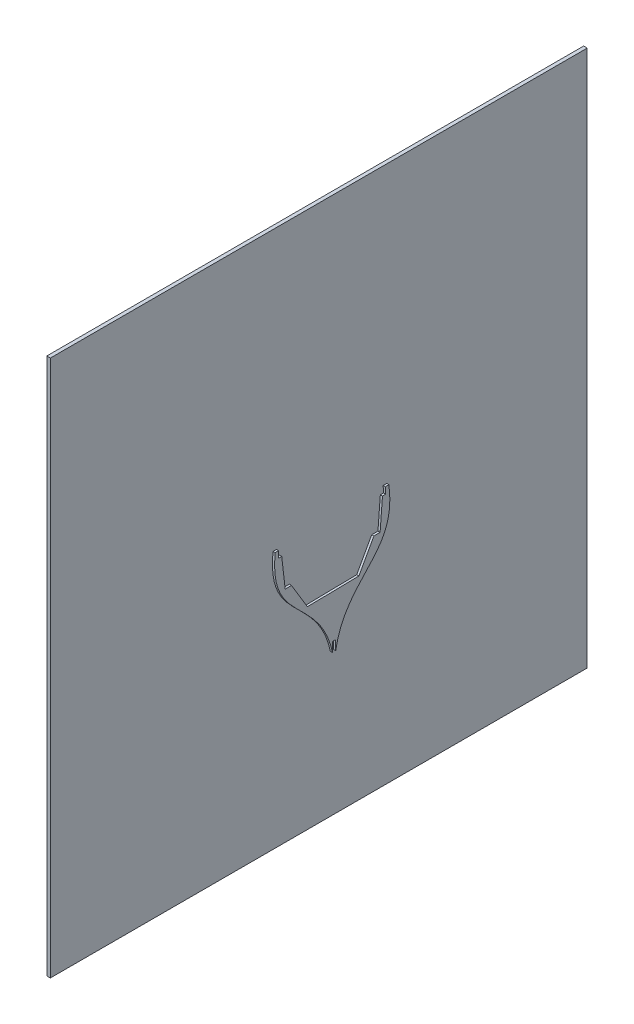
ISO-10303-21;
HEADER;
FILE_DESCRIPTION(('STEP AP214'),'2;1');
FILE_NAME('part.step','',(''),(''),'','','');
FILE_SCHEMA(('AUTOMOTIVE_DESIGN { 1 0 10303 214 1 1 1 1 }'));
ENDSEC;
DATA;
#1=APPLICATION_CONTEXT('core data for automotive mechanical design processes');
#2=APPLICATION_PROTOCOL_DEFINITION('international standard','automotive_design',2000,#1);
#3=PRODUCT_CONTEXT('',#1,'mechanical');
#4=PRODUCT('Part','Part','',(#3));
#5=PRODUCT_RELATED_PRODUCT_CATEGORY('part','',(#4));
#6=PRODUCT_DEFINITION_FORMATION('','',#4);
#7=PRODUCT_DEFINITION_CONTEXT('part definition',#1,'design');
#8=PRODUCT_DEFINITION('design','',#6,#7);
#9=PRODUCT_DEFINITION_SHAPE('','',#8);
#10=(LENGTH_UNIT() NAMED_UNIT(*) SI_UNIT(.MILLI.,.METRE.));
#11=(NAMED_UNIT(*) PLANE_ANGLE_UNIT() SI_UNIT($,.RADIAN.));
#12=(NAMED_UNIT(*) SI_UNIT($,.STERADIAN.) SOLID_ANGLE_UNIT());
#13=UNCERTAINTY_MEASURE_WITH_UNIT(LENGTH_MEASURE(1.E-05),#10,'distance_accuracy_value','');
#14=(GEOMETRIC_REPRESENTATION_CONTEXT(3) GLOBAL_UNCERTAINTY_ASSIGNED_CONTEXT((#13)) GLOBAL_UNIT_ASSIGNED_CONTEXT((#10,
#11,#12)) REPRESENTATION_CONTEXT('',''));
#15=CARTESIAN_POINT('',(0.,0.,0.));
#16=DIRECTION('',(0.,0.,1.));
#17=DIRECTION('',(1.,0.,0.));
#18=AXIS2_PLACEMENT_3D('',#15,#16,#17);
#19=CARTESIAN_POINT('',(6.,352.290806153637,165.357562292261));
#20=CARTESIAN_POINT('',(6.,144.442522752796,186.058304210706));
#21=CARTESIAN_POINT('',(6.,210.423165767166,8.75529863276436));
#22=CARTESIAN_POINT('',(6.,18.0649619587303,4.61229483232223));
#23=CARTESIAN_POINT('',(6.,0.,0.));
#24=B_SPLINE_CURVE_WITH_KNOTS('',4,(#19,#20,#21,#22,#23),.UNSPECIFIED.,.F.,.F.,(5,5),(0.,1.),.UNSPECIFIED.);
#25=DIRECTION('',(-1.,0.,0.));
#26=VECTOR('',#25,1.);
#27=SURFACE_OF_LINEAR_EXTRUSION('',#24,#26);
#28=CARTESIAN_POINT('',(0.,352.290806153637,165.357562292261));
#29=CARTESIAN_POINT('',(0.,144.442522752796,186.058304210706));
#30=CARTESIAN_POINT('',(0.,210.423165767166,8.75529863276436));
#31=CARTESIAN_POINT('',(0.,18.0649619587303,4.61229483232223));
#32=CARTESIAN_POINT('',(0.,0.,0.));
#33=B_SPLINE_CURVE_WITH_KNOTS('',4,(#28,#29,#30,#31,#32),.UNSPECIFIED.,.F.,.F.,(5,5),(0.,1.),.UNSPECIFIED.);
#34=CARTESIAN_POINT('',(0.,352.290806153637,165.357562292261));
#35=VERTEX_POINT('',#34);
#36=CARTESIAN_POINT('',(0.,30.3795413183631,5.05181360286008));
#37=VERTEX_POINT('',#36);
#38=EDGE_CURVE('E192',#35,#37,#33,.T.);
#39=ORIENTED_EDGE('',*,*,#38,.T.);
#40=DIRECTION('',(1.,0.,0.));
#41=VECTOR('',#40,1.);
#42=CARTESIAN_POINT('',(0.,30.3795413183631,5.05181360286008));
#43=LINE('',#42,#41);
#44=CARTESIAN_POINT('',(6.,30.3795413183631,5.05181360286008));
#45=VERTEX_POINT('',#44);
#46=EDGE_CURVE('E198',#37,#45,#43,.T.);
#47=ORIENTED_EDGE('',*,*,#46,.T.);
#48=CARTESIAN_POINT('',(6.,352.290806153637,165.357562292261));
#49=VERTEX_POINT('',#48);
#50=EDGE_CURVE('E232',#49,#45,#24,.T.);
#51=ORIENTED_EDGE('',*,*,#50,.F.);
#52=DIRECTION('',(-1.,0.,0.));
#53=VECTOR('',#52,1.);
#54=CARTESIAN_POINT('',(6.,352.290806153637,165.357562292261));
#55=LINE('',#54,#53);
#56=EDGE_CURVE('E188',#49,#35,#55,.T.);
#57=ORIENTED_EDGE('',*,*,#56,.T.);
#58=EDGE_LOOP('',(#39,#47,#51,#57));
#59=FACE_BOUND('',#58,.T.);
#60=ADVANCED_FACE('F45',(#59),#27,.F.);
#61=CARTESIAN_POINT('',(6.,0.,0.));
#62=CARTESIAN_POINT('',(6.,18.2201613043675,-3.95497613563854));
#63=CARTESIAN_POINT('',(6.,210.602210253033,-1.12826511189856));
#64=CARTESIAN_POINT('',(6.,151.086572632435,-180.704683157741));
#65=CARTESIAN_POINT('',(6.,358.048725482523,-152.489493696973));
#66=B_SPLINE_CURVE_WITH_KNOTS('',4,(#61,#62,#63,#64,#65),.UNSPECIFIED.,.F.,.F.,(5,5),(0.,1.),.UNSPECIFIED.);
#67=DIRECTION('',(-1.,0.,0.));
#68=VECTOR('',#67,1.);
#69=SURFACE_OF_LINEAR_EXTRUSION('',#66,#68);
#70=CARTESIAN_POINT('',(6.,30.5425797136652,-3.94818639713992));
#71=VERTEX_POINT('',#70);
#72=CARTESIAN_POINT('',(6.,358.048725482523,-152.489493696973));
#73=VERTEX_POINT('',#72);
#74=EDGE_CURVE('E128',#71,#73,#66,.T.);
#75=ORIENTED_EDGE('',*,*,#74,.F.);
#76=DIRECTION('',(1.,0.,0.));
#77=VECTOR('',#76,1.);
#78=CARTESIAN_POINT('',(0.,30.5425797136652,-3.94818639713992));
#79=LINE('',#78,#77);
#80=CARTESIAN_POINT('',(0.,30.5425797136652,-3.94818639713992));
#81=VERTEX_POINT('',#80);
#82=EDGE_CURVE('E322',#81,#71,#79,.T.);
#83=ORIENTED_EDGE('',*,*,#82,.F.);
#84=CARTESIAN_POINT('',(0.,0.,0.));
#85=CARTESIAN_POINT('',(0.,18.2201613043675,-3.95497613563854));
#86=CARTESIAN_POINT('',(0.,210.602210253033,-1.12826511189856));
#87=CARTESIAN_POINT('',(0.,151.086572632435,-180.704683157741));
#88=CARTESIAN_POINT('',(0.,358.048725482523,-152.489493696973));
#89=B_SPLINE_CURVE_WITH_KNOTS('',4,(#84,#85,#86,#87,#88),.UNSPECIFIED.,.F.,.F.,(5,5),(0.,1.),.UNSPECIFIED.);
#90=CARTESIAN_POINT('',(0.,358.048725482523,-152.489493696973));
#91=VERTEX_POINT('',#90);
#92=EDGE_CURVE('E197',#81,#91,#89,.T.);
#93=ORIENTED_EDGE('',*,*,#92,.T.);
#94=DIRECTION('',(-1.,0.,0.));
#95=VECTOR('',#94,1.);
#96=CARTESIAN_POINT('',(6.,358.048725482523,-152.489493696973));
#97=LINE('',#96,#95);
#98=EDGE_CURVE('E13',#73,#91,#97,.T.);
#99=ORIENTED_EDGE('',*,*,#98,.F.);
#100=EDGE_LOOP('',(#75,#83,#93,#99));
#101=FACE_BOUND('',#100,.T.);
#102=ADVANCED_FACE('F334',(#101),#69,.F.);
#103=CARTESIAN_POINT('',(6.,358.048725482523,-152.489493696973));
#104=DIRECTION('',(0.,-0.999835956927465,-0.0181124055536444));
#105=DIRECTION('',(0.,0.0181124055536444,-0.999835956927465));
#106=AXIS2_PLACEMENT_3D('',#103,#104,#105);
#107=PLANE('',#106);
#108=DIRECTION('',(0.,-0.0181124055536444,0.999835956927465));
#109=VECTOR('',#108,1.);
#110=CARTESIAN_POINT('',(0.,358.048725482523,-152.489493696973));
#111=LINE('',#110,#109);
#112=CARTESIAN_POINT('',(0.,357.867571709965,-142.489493696973));
#113=VERTEX_POINT('',#112);
#114=EDGE_CURVE('E205',#91,#113,#111,.T.);
#115=ORIENTED_EDGE('',*,*,#114,.T.);
#116=DIRECTION('',(-1.,0.,0.));
#117=VECTOR('',#116,1.);
#118=CARTESIAN_POINT('',(6.,357.867571709965,-142.489493696973));
#119=LINE('',#118,#117);
#120=CARTESIAN_POINT('',(6.,357.867571709965,-142.489493696973));
#121=VERTEX_POINT('',#120);
#122=EDGE_CURVE('E53',#121,#113,#119,.T.);
#123=ORIENTED_EDGE('',*,*,#122,.F.);
#124=DIRECTION('',(0.,-0.0181124055536444,0.999835956927465));
#125=VECTOR('',#124,1.);
#126=CARTESIAN_POINT('',(6.,358.048725482523,-152.489493696973));
#127=LINE('',#126,#125);
#128=EDGE_CURVE('E316',#73,#121,#127,.T.);
#129=ORIENTED_EDGE('',*,*,#128,.F.);
#130=ORIENTED_EDGE('',*,*,#98,.T.);
#131=EDGE_LOOP('',(#115,#123,#129,#130));
#132=FACE_BOUND('',#131,.T.);
#133=ADVANCED_FACE('F337',(#132),#107,.F.);
#134=CARTESIAN_POINT('',(6.,357.867571709965,-142.489493696973));
#135=DIRECTION('',(0.,0.0615422827320698,-0.998104477214748));
#136=DIRECTION('',(0.,0.998104477214748,0.0615422827320698));
#137=AXIS2_PLACEMENT_3D('',#134,#135,#136);
#138=PLANE('',#137);
#139=DIRECTION('',(0.,-0.998104477214748,-0.0615422827320698));
#140=VECTOR('',#139,1.);
#141=CARTESIAN_POINT('',(0.,357.867571709965,-142.489493696973));
#142=LINE('',#141,#140);
#143=CARTESIAN_POINT('',(0.,339.446305754548,-143.625333464844));
#144=VERTEX_POINT('',#143);
#145=EDGE_CURVE('E210',#113,#144,#142,.T.);
#146=ORIENTED_EDGE('',*,*,#145,.T.);
#147=DIRECTION('',(-1.,0.,0.));
#148=VECTOR('',#147,1.);
#149=CARTESIAN_POINT('',(6.,339.446305754548,-143.625333464844));
#150=LINE('',#149,#148);
#151=CARTESIAN_POINT('',(6.,339.446305754548,-143.625333464844));
#152=VERTEX_POINT('',#151);
#153=EDGE_CURVE('E257',#152,#144,#150,.T.);
#154=ORIENTED_EDGE('',*,*,#153,.F.);
#155=DIRECTION('',(0.,-0.998104477214748,-0.0615422827320698));
#156=VECTOR('',#155,1.);
#157=CARTESIAN_POINT('',(6.,357.867571709965,-142.489493696973));
#158=LINE('',#157,#156);
#159=EDGE_CURVE('E266',#121,#152,#158,.T.);
#160=ORIENTED_EDGE('',*,*,#159,.F.);
#161=ORIENTED_EDGE('',*,*,#122,.T.);
#162=EDGE_LOOP('',(#146,#154,#160,#161));
#163=FACE_BOUND('',#162,.T.);
#164=ADVANCED_FACE('F264',(#163),#138,.F.);
#165=CARTESIAN_POINT('',(6.,339.446305754548,-143.625333464844));
#166=DIRECTION('',(0.,-0.999835956927465,-0.0181124055536424));
#167=DIRECTION('',(0.,0.0181124055536424,-0.999835956927466));
#168=AXIS2_PLACEMENT_3D('',#165,#166,#167);
#169=PLANE('',#168);
#170=DIRECTION('',(0.,-0.0181124055536424,0.999835956927465));
#171=VECTOR('',#170,1.);
#172=CARTESIAN_POINT('',(0.,339.446305754548,-143.625333464844));
#173=LINE('',#172,#171);
#174=CARTESIAN_POINT('',(0.,339.282853519394,-134.602488792821));
#175=VERTEX_POINT('',#174);
#176=EDGE_CURVE('E212',#144,#175,#173,.T.);
#177=ORIENTED_EDGE('',*,*,#176,.T.);
#178=DIRECTION('',(-1.,0.,0.));
#179=VECTOR('',#178,1.);
#180=CARTESIAN_POINT('',(6.,339.282853519394,-134.602488792821));
#181=LINE('',#180,#179);
#182=CARTESIAN_POINT('',(6.,339.282853519394,-134.602488792821));
#183=VERTEX_POINT('',#182);
#184=EDGE_CURVE('E254',#183,#175,#181,.T.);
#185=ORIENTED_EDGE('',*,*,#184,.F.);
#186=DIRECTION('',(0.,-0.0181124055536424,0.999835956927465));
#187=VECTOR('',#186,1.);
#188=CARTESIAN_POINT('',(6.,339.446305754548,-143.625333464844));
#189=LINE('',#188,#187);
#190=EDGE_CURVE('E287',#152,#183,#189,.T.);
#191=ORIENTED_EDGE('',*,*,#190,.F.);
#192=ORIENTED_EDGE('',*,*,#153,.T.);
#193=EDGE_LOOP('',(#177,#185,#191,#192));
#194=FACE_BOUND('',#193,.T.);
#195=ADVANCED_FACE('F278',(#194),#169,.F.);
#196=CARTESIAN_POINT('',(6.,339.282853519394,-134.602488792821));
#197=DIRECTION('',(0.,-0.0779220815346801,-0.996959452139004));
#198=DIRECTION('',(0.,0.996959452139004,-0.0779220815346801));
#199=AXIS2_PLACEMENT_3D('',#196,#197,#198);
#200=PLANE('',#199);
#201=DIRECTION('',(0.,-0.996959452139004,0.0779220815346801));
#202=VECTOR('',#201,1.);
#203=CARTESIAN_POINT('',(0.,339.282853519394,-134.602488792821));
#204=LINE('',#203,#202);
#205=CARTESIAN_POINT('',(0.,254.940205778825,-128.01029022347));
#206=VERTEX_POINT('',#205);
#207=EDGE_CURVE('E214',#175,#206,#204,.T.);
#208=ORIENTED_EDGE('',*,*,#207,.T.);
#209=DIRECTION('',(-1.,0.,0.));
#210=VECTOR('',#209,1.);
#211=CARTESIAN_POINT('',(6.,254.940205778825,-128.01029022347));
#212=LINE('',#211,#210);
#213=CARTESIAN_POINT('',(6.,254.940205778825,-128.01029022347));
#214=VERTEX_POINT('',#213);
#215=EDGE_CURVE('E251',#214,#206,#212,.T.);
#216=ORIENTED_EDGE('',*,*,#215,.F.);
#217=DIRECTION('',(0.,-0.996959452139004,0.0779220815346801));
#218=VECTOR('',#217,1.);
#219=CARTESIAN_POINT('',(6.,339.282853519394,-134.602488792821));
#220=LINE('',#219,#218);
#221=EDGE_CURVE('E284',#183,#214,#220,.T.);
#222=ORIENTED_EDGE('',*,*,#221,.F.);
#223=ORIENTED_EDGE('',*,*,#184,.T.);
#224=EDGE_LOOP('',(#208,#216,#222,#223));
#225=FACE_BOUND('',#224,.T.);
#226=ADVANCED_FACE('F282',(#225),#200,.F.);
#227=CARTESIAN_POINT('',(6.,254.940205778825,-128.01029022347));
#228=DIRECTION('',(0.,-0.999835956927465,-0.0181124055536375));
#229=DIRECTION('',(0.,0.0181124055536375,-0.999835956927466));
#230=AXIS2_PLACEMENT_3D('',#227,#228,#229);
#231=PLANE('',#230);
#232=DIRECTION('',(0.,-0.0181124055536375,0.999835956927465));
#233=VECTOR('',#232,1.);
#234=CARTESIAN_POINT('',(0.,254.940205778825,-128.01029022347));
#235=LINE('',#234,#233);
#236=CARTESIAN_POINT('',(0.,254.624703577997,-110.594025777378));
#237=VERTEX_POINT('',#236);
#238=EDGE_CURVE('E216',#206,#237,#235,.T.);
#239=ORIENTED_EDGE('',*,*,#238,.T.);
#240=DIRECTION('',(-1.,0.,0.));
#241=VECTOR('',#240,1.);
#242=CARTESIAN_POINT('',(6.,254.624703577997,-110.594025777378));
#243=LINE('',#242,#241);
#244=CARTESIAN_POINT('',(6.,254.624703577997,-110.594025777378));
#245=VERTEX_POINT('',#244);
#246=EDGE_CURVE('E248',#245,#237,#243,.T.);
#247=ORIENTED_EDGE('',*,*,#246,.F.);
#248=DIRECTION('',(0.,-0.0181124055536375,0.999835956927465));
#249=VECTOR('',#248,1.);
#250=CARTESIAN_POINT('',(6.,254.940205778825,-128.01029022347));
#251=LINE('',#250,#249);
#252=EDGE_CURVE('E286',#214,#245,#251,.T.);
#253=ORIENTED_EDGE('',*,*,#252,.F.);
#254=ORIENTED_EDGE('',*,*,#215,.T.);
#255=EDGE_LOOP('',(#239,#247,#253,#254));
#256=FACE_BOUND('',#255,.T.);
#257=ADVANCED_FACE('F347',(#256),#231,.F.);
#258=CARTESIAN_POINT('',(6.,254.624703577997,-110.594025777378));
#259=DIRECTION('',(0.,-0.485084522291634,-0.87446726996103));
#260=DIRECTION('',(0.,0.87446726996103,-0.485084522291634));
#261=AXIS2_PLACEMENT_3D('',#258,#259,#260);
#262=PLANE('',#261);
#263=DIRECTION('',(0.,-0.87446726996103,0.485084522291634));
#264=VECTOR('',#263,1.);
#265=CARTESIAN_POINT('',(0.,254.624703577997,-110.594025777378));
#266=LINE('',#265,#264);
#267=CARTESIAN_POINT('',(0.,179.102765816581,-68.7004931547477));
#268=VERTEX_POINT('',#267);
#269=EDGE_CURVE('E218',#237,#268,#266,.T.);
#270=ORIENTED_EDGE('',*,*,#269,.T.);
#271=DIRECTION('',(-1.,0.,0.));
#272=VECTOR('',#271,1.);
#273=CARTESIAN_POINT('',(6.,179.102765816581,-68.7004931547477));
#274=LINE('',#273,#272);
#275=CARTESIAN_POINT('',(6.,179.102765816581,-68.7004931547477));
#276=VERTEX_POINT('',#275);
#277=EDGE_CURVE('E245',#276,#268,#274,.T.);
#278=ORIENTED_EDGE('',*,*,#277,.F.);
#279=DIRECTION('',(0.,-0.87446726996103,0.485084522291634));
#280=VECTOR('',#279,1.);
#281=CARTESIAN_POINT('',(6.,254.624703577997,-110.594025777378));
#282=LINE('',#281,#280);
#283=EDGE_CURVE('E289',#245,#276,#282,.T.);
#284=ORIENTED_EDGE('',*,*,#283,.F.);
#285=ORIENTED_EDGE('',*,*,#246,.T.);
#286=EDGE_LOOP('',(#270,#278,#284,#285));
#287=FACE_BOUND('',#286,.T.);
#288=ADVANCED_FACE('F350',(#287),#262,.F.);
#289=CARTESIAN_POINT('',(6.,179.102765816581,-68.7004931547477));
#290=DIRECTION('',(0.,-0.999835956927465,-0.0181124055536429));
#291=DIRECTION('',(0.,0.0181124055536429,-0.999835956927466));
#292=AXIS2_PLACEMENT_3D('',#289,#290,#291);
#293=PLANE('',#292);
#294=DIRECTION('',(0.,-0.0181124055536429,0.999835956927465));
#295=VECTOR('',#294,1.);
#296=CARTESIAN_POINT('',(0.,179.102765816581,-68.7004931547477));
#297=LINE('',#296,#295);
#298=CARTESIAN_POINT('',(0.,176.496999044239,75.1423170472708));
#299=VERTEX_POINT('',#298);
#300=EDGE_CURVE('E220',#268,#299,#297,.T.);
#301=ORIENTED_EDGE('',*,*,#300,.T.);
#302=DIRECTION('',(-1.,0.,0.));
#303=VECTOR('',#302,1.);
#304=CARTESIAN_POINT('',(6.,176.496999044239,75.1423170472708));
#305=LINE('',#304,#303);
#306=CARTESIAN_POINT('',(6.,176.496999044239,75.1423170472708));
#307=VERTEX_POINT('',#306);
#308=EDGE_CURVE('E242',#307,#299,#305,.T.);
#309=ORIENTED_EDGE('',*,*,#308,.F.);
#310=DIRECTION('',(0.,-0.0181124055536429,0.999835956927465));
#311=VECTOR('',#310,1.);
#312=CARTESIAN_POINT('',(6.,179.102765816581,-68.7004931547477));
#313=LINE('',#312,#311);
#314=EDGE_CURVE('E295',#276,#307,#313,.T.);
#315=ORIENTED_EDGE('',*,*,#314,.F.);
#316=ORIENTED_EDGE('',*,*,#277,.T.);
#317=EDGE_LOOP('',(#301,#309,#315,#316));
#318=FACE_BOUND('',#317,.T.);
#319=ADVANCED_FACE('F354',(#318),#293,.F.);
#320=CARTESIAN_POINT('',(6.,250.452049110893,119.743681695466));
#321=DIRECTION('',(0.,-0.516438464591007,0.856324303223307));
#322=DIRECTION('',(0.,-0.856324303223307,-0.516438464591008));
#323=AXIS2_PLACEMENT_3D('',#320,#321,#322);
#324=PLANE('',#323);
#325=DIRECTION('',(0.,0.856324303223307,0.516438464591008));
#326=VECTOR('',#325,1.);
#327=CARTESIAN_POINT('',(0.,250.452049110893,119.743681695466));
#328=LINE('',#327,#326);
#329=CARTESIAN_POINT('',(0.,250.452049110893,119.743681695466));
#330=VERTEX_POINT('',#329);
#331=EDGE_CURVE('E222',#299,#330,#328,.T.);
#332=ORIENTED_EDGE('',*,*,#331,.T.);
#333=DIRECTION('',(-1.,0.,0.));
#334=VECTOR('',#333,1.);
#335=CARTESIAN_POINT('',(6.,250.452049110893,119.743681695466));
#336=LINE('',#335,#334);
#337=CARTESIAN_POINT('',(6.,250.452049110893,119.743681695466));
#338=VERTEX_POINT('',#337);
#339=EDGE_CURVE('E239',#338,#330,#336,.T.);
#340=ORIENTED_EDGE('',*,*,#339,.F.);
#341=DIRECTION('',(0.,0.856324303223307,0.516438464591008));
#342=VECTOR('',#341,1.);
#343=CARTESIAN_POINT('',(6.,250.452049110893,119.743681695466));
#344=LINE('',#343,#342);
#345=EDGE_CURVE('E297',#307,#338,#344,.T.);
#346=ORIENTED_EDGE('',*,*,#345,.F.);
#347=ORIENTED_EDGE('',*,*,#308,.T.);
#348=EDGE_LOOP('',(#332,#340,#346,#347));
#349=FACE_BOUND('',#348,.T.);
#350=ADVANCED_FACE('F358',(#349),#324,.F.);
#351=CARTESIAN_POINT('',(6.,250.136546910066,137.159946141558));
#352=DIRECTION('',(0.,-0.999835956927465,-0.0181124055536438));
#353=DIRECTION('',(0.,0.0181124055536438,-0.999835956927466));
#354=AXIS2_PLACEMENT_3D('',#351,#352,#353);
#355=PLANE('',#354);
#356=DIRECTION('',(0.,-0.0181124055536438,0.999835956927465));
#357=VECTOR('',#356,1.);
#358=CARTESIAN_POINT('',(0.,250.136546910066,137.159946141558));
#359=LINE('',#358,#357);
#360=CARTESIAN_POINT('',(0.,250.136546910066,137.159946141558));
#361=VERTEX_POINT('',#360);
#362=EDGE_CURVE('E224',#330,#361,#359,.T.);
#363=ORIENTED_EDGE('',*,*,#362,.T.);
#364=DIRECTION('',(-1.,0.,0.));
#365=VECTOR('',#364,1.);
#366=CARTESIAN_POINT('',(6.,250.136546910066,137.159946141558));
#367=LINE('',#366,#365);
#368=CARTESIAN_POINT('',(6.,250.136546910066,137.159946141558));
#369=VERTEX_POINT('',#368);
#370=EDGE_CURVE('E236',#369,#361,#367,.T.);
#371=ORIENTED_EDGE('',*,*,#370,.F.);
#372=DIRECTION('',(0.,-0.0181124055536438,0.999835956927465));
#373=VECTOR('',#372,1.);
#374=CARTESIAN_POINT('',(6.,250.136546910066,137.159946141558));
#375=LINE('',#374,#373);
#376=EDGE_CURVE('E299',#338,#369,#375,.T.);
#377=ORIENTED_EDGE('',*,*,#376,.F.);
#378=ORIENTED_EDGE('',*,*,#339,.T.);
#379=EDGE_LOOP('',(#363,#371,#377,#378));
#380=FACE_BOUND('',#379,.T.);
#381=ADVANCED_FACE('F305',(#380),#355,.F.);
#382=CARTESIAN_POINT('',(6.,334.185093907371,146.802614730138));
#383=DIRECTION('',(0.,-0.113979698892057,0.993483078990516));
#384=DIRECTION('',(0.,-0.993483078990516,-0.113979698892057));
#385=AXIS2_PLACEMENT_3D('',#382,#383,#384);
#386=PLANE('',#385);
#387=DIRECTION('',(0.,0.993483078990516,0.113979698892057));
#388=VECTOR('',#387,1.);
#389=CARTESIAN_POINT('',(0.,334.185093907371,146.802614730138));
#390=LINE('',#389,#388);
#391=CARTESIAN_POINT('',(0.,334.185093907371,146.802614730138));
#392=VERTEX_POINT('',#391);
#393=EDGE_CURVE('E226',#361,#392,#390,.T.);
#394=ORIENTED_EDGE('',*,*,#393,.T.);
#395=DIRECTION('',(-1.,0.,0.));
#396=VECTOR('',#395,1.);
#397=CARTESIAN_POINT('',(6.,334.185093907371,146.802614730138));
#398=LINE('',#397,#396);
#399=CARTESIAN_POINT('',(6.,334.185093907371,146.802614730138));
#400=VERTEX_POINT('',#399);
#401=EDGE_CURVE('E183',#400,#392,#398,.T.);
#402=ORIENTED_EDGE('',*,*,#401,.F.);
#403=DIRECTION('',(0.,0.993483078990516,0.113979698892057));
#404=VECTOR('',#403,1.);
#405=CARTESIAN_POINT('',(6.,334.185093907371,146.802614730138));
#406=LINE('',#405,#404);
#407=EDGE_CURVE('E171',#369,#400,#406,.T.);
#408=ORIENTED_EDGE('',*,*,#407,.F.);
#409=ORIENTED_EDGE('',*,*,#370,.T.);
#410=EDGE_LOOP('',(#394,#402,#408,#409));
#411=FACE_BOUND('',#410,.T.);
#412=ADVANCED_FACE('F309',(#411),#386,.F.);
#413=CARTESIAN_POINT('',(6.,334.021641672217,155.825459402161));
#414=DIRECTION('',(0.,-0.999835956927465,-0.018112405553636));
#415=DIRECTION('',(0.,0.018112405553636,-0.999835956927466));
#416=AXIS2_PLACEMENT_3D('',#413,#414,#415);
#417=PLANE('',#416);
#418=DIRECTION('',(0.,-0.018112405553636,0.999835956927465));
#419=VECTOR('',#418,1.);
#420=CARTESIAN_POINT('',(0.,334.021641672217,155.825459402161));
#421=LINE('',#420,#419);
#422=CARTESIAN_POINT('',(0.,334.021641672217,155.825459402161));
#423=VERTEX_POINT('',#422);
#424=EDGE_CURVE('E180',#392,#423,#421,.T.);
#425=ORIENTED_EDGE('',*,*,#424,.T.);
#426=DIRECTION('',(-1.,0.,0.));
#427=VECTOR('',#426,1.);
#428=CARTESIAN_POINT('',(6.,334.021641672217,155.825459402161));
#429=LINE('',#428,#427);
#430=CARTESIAN_POINT('',(6.,334.021641672217,155.825459402161));
#431=VERTEX_POINT('',#430);
#432=EDGE_CURVE('E177',#431,#423,#429,.T.);
#433=ORIENTED_EDGE('',*,*,#432,.F.);
#434=DIRECTION('',(0.,-0.018112405553636,0.999835956927465));
#435=VECTOR('',#434,1.);
#436=CARTESIAN_POINT('',(6.,334.021641672217,155.825459402161));
#437=LINE('',#436,#435);
#438=EDGE_CURVE('E163',#400,#431,#437,.T.);
#439=ORIENTED_EDGE('',*,*,#438,.F.);
#440=ORIENTED_EDGE('',*,*,#401,.T.);
#441=EDGE_LOOP('',(#425,#433,#439,#440));
#442=FACE_BOUND('',#441,.T.);
#443=ADVANCED_FACE('F178',(#442),#417,.F.);
#444=CARTESIAN_POINT('',(6.,352.471959926194,155.357562292262));
#445=DIRECTION('',(0.,0.0253516887165519,0.999678594288794));
#446=DIRECTION('',(0.,-0.999678594288794,0.025351688716552));
#447=AXIS2_PLACEMENT_3D('',#444,#445,#446);
#448=PLANE('',#447);
#449=DIRECTION('',(0.,0.999678594288794,-0.0253516887165519));
#450=VECTOR('',#449,1.);
#451=CARTESIAN_POINT('',(0.,352.471959926194,155.357562292262));
#452=LINE('',#451,#450);
#453=CARTESIAN_POINT('',(0.,352.471959926194,155.357562292262));
#454=VERTEX_POINT('',#453);
#455=EDGE_CURVE('E229',#423,#454,#452,.T.);
#456=ORIENTED_EDGE('',*,*,#455,.T.);
#457=DIRECTION('',(-1.,0.,0.));
#458=VECTOR('',#457,1.);
#459=CARTESIAN_POINT('',(6.,352.471959926194,155.357562292262));
#460=LINE('',#459,#458);
#461=CARTESIAN_POINT('',(6.,352.471959926194,155.357562292262));
#462=VERTEX_POINT('',#461);
#463=EDGE_CURVE('E184',#462,#454,#460,.T.);
#464=ORIENTED_EDGE('',*,*,#463,.F.);
#465=DIRECTION('',(0.,0.999678594288794,-0.0253516887165519));
#466=VECTOR('',#465,1.);
#467=CARTESIAN_POINT('',(6.,352.471959926194,155.357562292262));
#468=LINE('',#467,#466);
#469=EDGE_CURVE('E168',#431,#462,#468,.T.);
#470=ORIENTED_EDGE('',*,*,#469,.F.);
#471=ORIENTED_EDGE('',*,*,#432,.T.);
#472=EDGE_LOOP('',(#456,#464,#470,#471));
#473=FACE_BOUND('',#472,.T.);
#474=ADVANCED_FACE('F186',(#473),#448,.F.);
#475=CARTESIAN_POINT('',(6.,352.290806153637,165.357562292261));
#476=DIRECTION('',(0.,-0.999835956927465,-0.0181124055536449));
#477=DIRECTION('',(0.,0.0181124055536449,-0.999835956927465));
#478=AXIS2_PLACEMENT_3D('',#475,#476,#477);
#479=PLANE('',#478);
#480=DIRECTION('',(0.,-0.0181124055536449,0.999835956927465));
#481=VECTOR('',#480,1.);
#482=CARTESIAN_POINT('',(0.,352.290806153637,165.357562292261));
#483=LINE('',#482,#481);
#484=EDGE_CURVE('E120',#454,#35,#483,.T.);
#485=ORIENTED_EDGE('',*,*,#484,.T.);
#486=ORIENTED_EDGE('',*,*,#56,.F.);
#487=DIRECTION('',(0.,-0.0181124055536449,0.999835956927465));
#488=VECTOR('',#487,1.);
#489=CARTESIAN_POINT('',(6.,352.290806153637,165.357562292261));
#490=LINE('',#489,#488);
#491=EDGE_CURVE('E69',#462,#49,#490,.T.);
#492=ORIENTED_EDGE('',*,*,#491,.F.);
#493=ORIENTED_EDGE('',*,*,#463,.T.);
#494=EDGE_LOOP('',(#485,#486,#492,#493));
#495=FACE_BOUND('',#494,.T.);
#496=ADVANCED_FACE('F311',(#495),#479,.F.);
#497=CARTESIAN_POINT('',(6.,141.553733725171,61.28573439131));
#498=DIRECTION('',(1.,0.,0.));
#499=DIRECTION('',(0.,0.,-1.));
#500=AXIS2_PLACEMENT_3D('',#497,#498,#499);
#501=PLANE('',#500);
#502=DIRECTION('',(0.,-0.999835956927465,-0.018112405553643));
#503=VECTOR('',#502,1.);
#504=CARTESIAN_POINT('',(6.,30.3795413183631,5.05181360286008));
#505=LINE('',#504,#503);
#506=CARTESIAN_POINT('',(6.,57.3795413183631,5.54092878876636));
#507=VERTEX_POINT('',#506);
#508=EDGE_CURVE('E510',#507,#45,#505,.T.);
#509=ORIENTED_EDGE('',*,*,#508,.F.);
#510=DIRECTION('',(0.,-0.0181124055536438,0.999835956927465));
#511=VECTOR('',#510,1.);
#512=CARTESIAN_POINT('',(6.,57.3795413183631,5.54092878876636));
#513=LINE('',#512,#511);
#514=CARTESIAN_POINT('',(6.,57.5425797136652,-3.45907121123364));
#515=VERTEX_POINT('',#514);
#516=EDGE_CURVE('E519',#515,#507,#513,.T.);
#517=ORIENTED_EDGE('',*,*,#516,.F.);
#518=DIRECTION('',(0.,0.999835956927465,0.0181124055536428));
#519=VECTOR('',#518,1.);
#520=CARTESIAN_POINT('',(6.,57.5425797136652,-3.45907121123364));
#521=LINE('',#520,#519);
#522=EDGE_CURVE('E523',#71,#515,#521,.T.);
#523=ORIENTED_EDGE('',*,*,#522,.F.);
#524=ORIENTED_EDGE('',*,*,#74,.T.);
#525=ORIENTED_EDGE('',*,*,#128,.T.);
#526=ORIENTED_EDGE('',*,*,#159,.T.);
#527=ORIENTED_EDGE('',*,*,#190,.T.);
#528=ORIENTED_EDGE('',*,*,#221,.T.);
#529=ORIENTED_EDGE('',*,*,#252,.T.);
#530=ORIENTED_EDGE('',*,*,#283,.T.);
#531=ORIENTED_EDGE('',*,*,#314,.T.);
#532=ORIENTED_EDGE('',*,*,#345,.T.);
#533=ORIENTED_EDGE('',*,*,#376,.T.);
#534=ORIENTED_EDGE('',*,*,#407,.T.);
#535=ORIENTED_EDGE('',*,*,#438,.T.);
#536=ORIENTED_EDGE('',*,*,#469,.T.);
#537=ORIENTED_EDGE('',*,*,#491,.T.);
#538=ORIENTED_EDGE('',*,*,#50,.T.);
#539=EDGE_LOOP('',(#509,#517,#523,#524,#525,#526,#527,#528,#529,#530,#531,#532,#533,#534,#535,
#536,#537,#538));
#540=FACE_BOUND('',#539,.T.);
#541=ADVANCED_FACE('F166',(#540),#501,.T.);
#542=CARTESIAN_POINT('',(0.,141.553733725171,61.28573439131));
#543=DIRECTION('',(1.,0.,0.));
#544=DIRECTION('',(0.,0.,-1.));
#545=AXIS2_PLACEMENT_3D('',#542,#543,#544);
#546=PLANE('',#545);
#547=DIRECTION('',(0.,-0.0181124055536438,0.999835956927465));
#548=VECTOR('',#547,1.);
#549=CARTESIAN_POINT('',(0.,57.3795413183631,5.54092878876636));
#550=LINE('',#549,#548);
#551=CARTESIAN_POINT('',(0.,57.5425797136652,-3.45907121123363));
#552=VERTEX_POINT('',#551);
#553=CARTESIAN_POINT('',(0.,57.3795413183631,5.54092878876636));
#554=VERTEX_POINT('',#553);
#555=EDGE_CURVE('E60',#552,#554,#550,.T.);
#556=ORIENTED_EDGE('',*,*,#555,.T.);
#557=DIRECTION('',(0.,-0.999835956927465,-0.018112405553643));
#558=VECTOR('',#557,1.);
#559=CARTESIAN_POINT('',(0.,30.3795413183631,5.05181360286008));
#560=LINE('',#559,#558);
#561=EDGE_CURVE('E532',#554,#37,#560,.T.);
#562=ORIENTED_EDGE('',*,*,#561,.T.);
#563=ORIENTED_EDGE('',*,*,#38,.F.);
#564=ORIENTED_EDGE('',*,*,#484,.F.);
#565=ORIENTED_EDGE('',*,*,#455,.F.);
#566=ORIENTED_EDGE('',*,*,#424,.F.);
#567=ORIENTED_EDGE('',*,*,#393,.F.);
#568=ORIENTED_EDGE('',*,*,#362,.F.);
#569=ORIENTED_EDGE('',*,*,#331,.F.);
#570=ORIENTED_EDGE('',*,*,#300,.F.);
#571=ORIENTED_EDGE('',*,*,#269,.F.);
#572=ORIENTED_EDGE('',*,*,#238,.F.);
#573=ORIENTED_EDGE('',*,*,#207,.F.);
#574=ORIENTED_EDGE('',*,*,#176,.F.);
#575=ORIENTED_EDGE('',*,*,#145,.F.);
#576=ORIENTED_EDGE('',*,*,#114,.F.);
#577=ORIENTED_EDGE('',*,*,#92,.F.);
#578=DIRECTION('',(0.,0.999835956927465,0.0181124055536428));
#579=VECTOR('',#578,1.);
#580=CARTESIAN_POINT('',(0.,57.5425797136652,-3.45907121123364));
#581=LINE('',#580,#579);
#582=EDGE_CURVE('E518',#81,#552,#581,.T.);
#583=ORIENTED_EDGE('',*,*,#582,.T.);
#584=EDGE_LOOP('',(#556,#562,#563,#564,#565,#566,#567,#568,#569,#570,#571,#572,#573,#574,#575,
#576,#577,#583));
#585=FACE_BOUND('',#584,.T.);
#586=ADVANCED_FACE('F272',(#585),#546,.F.);
#587=CARTESIAN_POINT('',(0.,30.3795413183631,5.05181360286008));
#588=DIRECTION('',(0.,-0.0181124055536429,0.999835956927465));
#589=DIRECTION('',(0.,-0.999835956927466,-0.018112405553643));
#590=AXIS2_PLACEMENT_3D('',#587,#588,#589);
#591=PLANE('',#590);
#592=ORIENTED_EDGE('',*,*,#508,.T.);
#593=ORIENTED_EDGE('',*,*,#46,.F.);
#594=ORIENTED_EDGE('',*,*,#561,.F.);
#595=DIRECTION('',(1.,0.,0.));
#596=VECTOR('',#595,1.);
#597=CARTESIAN_POINT('',(0.,57.3795413183631,5.54092878876636));
#598=LINE('',#597,#596);
#599=EDGE_CURVE('E514',#554,#507,#598,.T.);
#600=ORIENTED_EDGE('',*,*,#599,.T.);
#601=EDGE_LOOP('',(#592,#593,#594,#600));
#602=FACE_BOUND('',#601,.T.);
#603=ADVANCED_FACE('F375',(#602),#591,.F.);
#604=CARTESIAN_POINT('',(0.,57.3795413183631,5.54092878876636));
#605=DIRECTION('',(0.,0.999835956927465,0.0181124055536438));
#606=DIRECTION('',(0.,-0.0181124055536438,0.999835956927466));
#607=AXIS2_PLACEMENT_3D('',#604,#605,#606);
#608=PLANE('',#607);
#609=ORIENTED_EDGE('',*,*,#516,.T.);
#610=ORIENTED_EDGE('',*,*,#599,.F.);
#611=ORIENTED_EDGE('',*,*,#555,.F.);
#612=DIRECTION('',(1.,0.,0.));
#613=VECTOR('',#612,1.);
#614=CARTESIAN_POINT('',(0.,57.5425797136652,-3.45907121123364));
#615=LINE('',#614,#613);
#616=EDGE_CURVE('E528',#552,#515,#615,.T.);
#617=ORIENTED_EDGE('',*,*,#616,.T.);
#618=EDGE_LOOP('',(#609,#610,#611,#617));
#619=FACE_BOUND('',#618,.T.);
#620=ADVANCED_FACE('F381',(#619),#608,.F.);
#621=CARTESIAN_POINT('',(0.,57.5425797136652,-3.45907121123364));
#622=DIRECTION('',(0.,0.0181124055536428,-0.999835956927465));
#623=DIRECTION('',(0.,0.999835956927466,0.0181124055536428));
#624=AXIS2_PLACEMENT_3D('',#621,#622,#623);
#625=PLANE('',#624);
#626=ORIENTED_EDGE('',*,*,#522,.T.);
#627=ORIENTED_EDGE('',*,*,#616,.F.);
#628=ORIENTED_EDGE('',*,*,#582,.F.);
#629=ORIENTED_EDGE('',*,*,#82,.T.);
#630=EDGE_LOOP('',(#626,#627,#628,#629));
#631=FACE_BOUND('',#630,.T.);
#632=ADVANCED_FACE('F378',(#631),#625,.F.);
#633=CLOSED_SHELL('',(#60,#102,#133,#164,#195,#226,#257,#288,#319,#350,#381,#412,#443,#474,#496,
#541,#586,#603,#620,#632));
#634=MANIFOLD_SOLID_BREP('B2',#633);
#635=CARTESIAN_POINT('',(-10.,0.,0.));
#636=DIRECTION('',(-1.,0.,0.));
#637=DIRECTION('',(0.,0.,1.));
#638=AXIS2_PLACEMENT_3D('',#635,#636,#637);
#639=PLANE('',#638);
#640=DIRECTION('',(0.,0.,-1.));
#641=VECTOR('',#640,1.);
#642=CARTESIAN_POINT('',(-10.,-378.710653275796,777.274991403029));
#643=LINE('',#642,#641);
#644=CARTESIAN_POINT('',(-10.,-378.710653275796,777.274991403029));
#645=VERTEX_POINT('',#644);
#646=CARTESIAN_POINT('',(-10.,-378.710653275796,-722.725008596971));
#647=VERTEX_POINT('',#646);
#648=EDGE_CURVE('E565',#645,#647,#643,.T.);
#649=ORIENTED_EDGE('',*,*,#648,.T.);
#650=DIRECTION('',(0.,-1.,0.));
#651=VECTOR('',#650,1.);
#652=CARTESIAN_POINT('',(-10.,1121.2893467242,-722.725008596971));
#653=LINE('',#652,#651);
#654=CARTESIAN_POINT('',(-10.,1121.2893467242,-722.725008596971));
#655=VERTEX_POINT('',#654);
#656=EDGE_CURVE('E599',#655,#647,#653,.T.);
#657=ORIENTED_EDGE('',*,*,#656,.F.);
#658=DIRECTION('',(0.,0.,-1.));
#659=VECTOR('',#658,1.);
#660=CARTESIAN_POINT('',(-10.,1121.2893467242,777.274991403029));
#661=LINE('',#660,#659);
#662=CARTESIAN_POINT('',(-10.,1121.2893467242,777.274991403029));
#663=VERTEX_POINT('',#662);
#664=EDGE_CURVE('E596',#663,#655,#661,.T.);
#665=ORIENTED_EDGE('',*,*,#664,.F.);
#666=DIRECTION('',(0.,-1.,0.));
#667=VECTOR('',#666,1.);
#668=CARTESIAN_POINT('',(-10.,1121.2893467242,777.274991403029));
#669=LINE('',#668,#667);
#670=EDGE_CURVE('E593',#663,#645,#669,.T.);
#671=ORIENTED_EDGE('',*,*,#670,.T.);
#672=EDGE_LOOP('',(#649,#657,#665,#671));
#673=FACE_BOUND('',#672,.T.);
#674=ADVANCED_FACE('F556',(#673),#639,.F.);
#675=CARTESIAN_POINT('',(-20.,0.,0.));
#676=DIRECTION('',(-1.,0.,0.));
#677=DIRECTION('',(0.,0.,1.));
#678=AXIS2_PLACEMENT_3D('',#675,#676,#677);
#679=PLANE('',#678);
#680=DIRECTION('',(0.,0.,-1.));
#681=VECTOR('',#680,1.);
#682=CARTESIAN_POINT('',(-20.,-378.710653275796,777.274991403029));
#683=LINE('',#682,#681);
#684=CARTESIAN_POINT('',(-20.,-378.710653275796,777.274991403029));
#685=VERTEX_POINT('',#684);
#686=CARTESIAN_POINT('',(-20.,-378.710653275796,-722.725008596971));
#687=VERTEX_POINT('',#686);
#688=EDGE_CURVE('E43',#685,#687,#683,.T.);
#689=ORIENTED_EDGE('',*,*,#688,.F.);
#690=DIRECTION('',(0.,-1.,0.));
#691=VECTOR('',#690,1.);
#692=CARTESIAN_POINT('',(-20.,1121.2893467242,777.274991403029));
#693=LINE('',#692,#691);
#694=CARTESIAN_POINT('',(-20.,1121.2893467242,777.274991403029));
#695=VERTEX_POINT('',#694);
#696=EDGE_CURVE('E612',#695,#685,#693,.T.);
#697=ORIENTED_EDGE('',*,*,#696,.F.);
#698=DIRECTION('',(0.,0.,-1.));
#699=VECTOR('',#698,1.);
#700=CARTESIAN_POINT('',(-20.,1121.2893467242,777.274991403029));
#701=LINE('',#700,#699);
#702=CARTESIAN_POINT('',(-20.,1121.2893467242,-722.725008596971));
#703=VERTEX_POINT('',#702);
#704=EDGE_CURVE('E603',#695,#703,#701,.T.);
#705=ORIENTED_EDGE('',*,*,#704,.T.);
#706=DIRECTION('',(0.,-1.,0.));
#707=VECTOR('',#706,1.);
#708=CARTESIAN_POINT('',(-20.,1121.2893467242,-722.725008596971));
#709=LINE('',#708,#707);
#710=EDGE_CURVE('E574',#703,#687,#709,.T.);
#711=ORIENTED_EDGE('',*,*,#710,.T.);
#712=EDGE_LOOP('',(#689,#697,#705,#711));
#713=FACE_BOUND('',#712,.T.);
#714=ADVANCED_FACE('F652',(#713),#679,.T.);
#715=CARTESIAN_POINT('',(-20.,1121.2893467242,777.274991403029));
#716=DIRECTION('',(0.,0.,1.));
#717=DIRECTION('',(1.,0.,0.));
#718=AXIS2_PLACEMENT_3D('',#715,#716,#717);
#719=PLANE('',#718);
#720=ORIENTED_EDGE('',*,*,#670,.F.);
#721=DIRECTION('',(1.,0.,0.));
#722=VECTOR('',#721,1.);
#723=CARTESIAN_POINT('',(-20.,1121.2893467242,777.274991403029));
#724=LINE('',#723,#722);
#725=EDGE_CURVE('E608',#695,#663,#724,.T.);
#726=ORIENTED_EDGE('',*,*,#725,.F.);
#727=ORIENTED_EDGE('',*,*,#696,.T.);
#728=DIRECTION('',(1.,0.,0.));
#729=VECTOR('',#728,1.);
#730=CARTESIAN_POINT('',(-20.,-378.710653275796,777.274991403029));
#731=LINE('',#730,#729);
#732=EDGE_CURVE('E604',#685,#645,#731,.T.);
#733=ORIENTED_EDGE('',*,*,#732,.T.);
#734=EDGE_LOOP('',(#720,#726,#727,#733));
#735=FACE_BOUND('',#734,.T.);
#736=ADVANCED_FACE('F613',(#735),#719,.T.);
#737=CARTESIAN_POINT('',(-20.,-378.710653275796,777.274991403029));
#738=DIRECTION('',(0.,-1.,0.));
#739=DIRECTION('',(0.,0.,-1.));
#740=AXIS2_PLACEMENT_3D('',#737,#738,#739);
#741=PLANE('',#740);
#742=ORIENTED_EDGE('',*,*,#648,.F.);
#743=ORIENTED_EDGE('',*,*,#732,.F.);
#744=ORIENTED_EDGE('',*,*,#688,.T.);
#745=DIRECTION('',(1.,0.,0.));
#746=VECTOR('',#745,1.);
#747=CARTESIAN_POINT('',(-20.,-378.710653275796,-722.725008596971));
#748=LINE('',#747,#746);
#749=EDGE_CURVE('E624',#687,#647,#748,.T.);
#750=ORIENTED_EDGE('',*,*,#749,.T.);
#751=EDGE_LOOP('',(#742,#743,#744,#750));
#752=FACE_BOUND('',#751,.T.);
#753=ADVANCED_FACE('F654',(#752),#741,.T.);
#754=CARTESIAN_POINT('',(-20.,1121.2893467242,777.274991403029));
#755=DIRECTION('',(0.,-1.,0.));
#756=DIRECTION('',(0.,0.,-1.));
#757=AXIS2_PLACEMENT_3D('',#754,#755,#756);
#758=PLANE('',#757);
#759=ORIENTED_EDGE('',*,*,#664,.T.);
#760=DIRECTION('',(1.,0.,0.));
#761=VECTOR('',#760,1.);
#762=CARTESIAN_POINT('',(-20.,1121.2893467242,-722.725008596971));
#763=LINE('',#762,#761);
#764=EDGE_CURVE('E628',#703,#655,#763,.T.);
#765=ORIENTED_EDGE('',*,*,#764,.F.);
#766=ORIENTED_EDGE('',*,*,#704,.F.);
#767=ORIENTED_EDGE('',*,*,#725,.T.);
#768=EDGE_LOOP('',(#759,#765,#766,#767));
#769=FACE_BOUND('',#768,.T.);
#770=ADVANCED_FACE('F609',(#769),#758,.F.);
#771=CARTESIAN_POINT('',(-20.,1121.2893467242,-722.725008596971));
#772=DIRECTION('',(0.,0.,1.));
#773=DIRECTION('',(1.,0.,0.));
#774=AXIS2_PLACEMENT_3D('',#771,#772,#773);
#775=PLANE('',#774);
#776=ORIENTED_EDGE('',*,*,#656,.T.);
#777=ORIENTED_EDGE('',*,*,#749,.F.);
#778=ORIENTED_EDGE('',*,*,#710,.F.);
#779=ORIENTED_EDGE('',*,*,#764,.T.);
#780=EDGE_LOOP('',(#776,#777,#778,#779));
#781=FACE_BOUND('',#780,.T.);
#782=ADVANCED_FACE('F639',(#781),#775,.F.);
#783=CLOSED_SHELL('',(#674,#714,#736,#753,#770,#782));
#784=MANIFOLD_SOLID_BREP('B7_NOT_SHOWN',#783);
#785=ADVANCED_BREP_SHAPE_REPRESENTATION('',(#18,#634,#784),#14);
#786=SHAPE_DEFINITION_REPRESENTATION(#9,#785);
ENDSEC;
END-ISO-10303-21;
